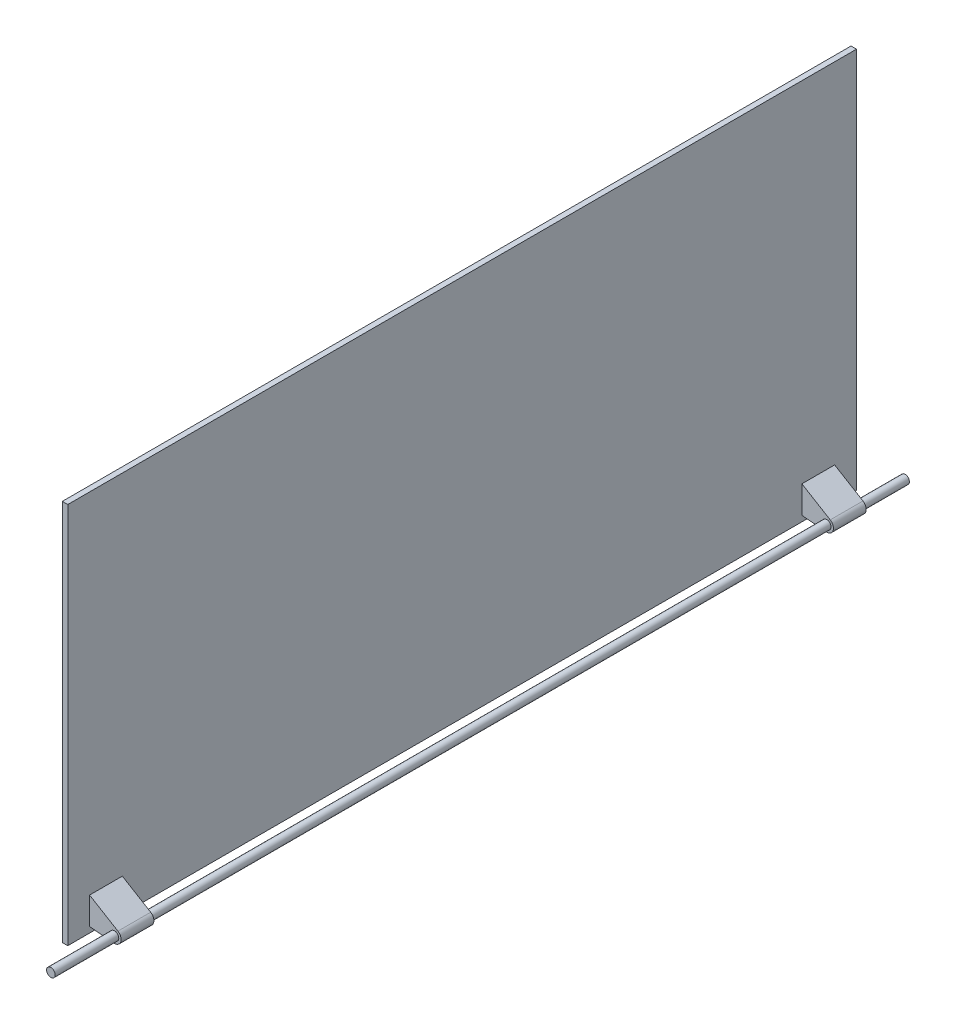
ISO-10303-21;
HEADER;
FILE_DESCRIPTION(('STEP AP214'),'2;1');
FILE_NAME('part.step','',(''),(''),'','','');
FILE_SCHEMA(('AUTOMOTIVE_DESIGN { 1 0 10303 214 1 1 1 1 }'));
ENDSEC;
DATA;
#1=APPLICATION_CONTEXT('core data for automotive mechanical design processes');
#2=APPLICATION_PROTOCOL_DEFINITION('international standard','automotive_design',2000,#1);
#3=PRODUCT_CONTEXT('',#1,'mechanical');
#4=PRODUCT('Part','Part','',(#3));
#5=PRODUCT_RELATED_PRODUCT_CATEGORY('part','',(#4));
#6=PRODUCT_DEFINITION_FORMATION('','',#4);
#7=PRODUCT_DEFINITION_CONTEXT('part definition',#1,'design');
#8=PRODUCT_DEFINITION('design','',#6,#7);
#9=PRODUCT_DEFINITION_SHAPE('','',#8);
#10=(LENGTH_UNIT() NAMED_UNIT(*) SI_UNIT(.MILLI.,.METRE.));
#11=(NAMED_UNIT(*) PLANE_ANGLE_UNIT() SI_UNIT($,.RADIAN.));
#12=(NAMED_UNIT(*) SI_UNIT($,.STERADIAN.) SOLID_ANGLE_UNIT());
#13=UNCERTAINTY_MEASURE_WITH_UNIT(LENGTH_MEASURE(1.E-05),#10,'distance_accuracy_value','');
#14=(GEOMETRIC_REPRESENTATION_CONTEXT(3) GLOBAL_UNCERTAINTY_ASSIGNED_CONTEXT((#13)) GLOBAL_UNIT_ASSIGNED_CONTEXT((#10,
#11,#12)) REPRESENTATION_CONTEXT('',''));
#15=CARTESIAN_POINT('',(0.,0.,0.));
#16=DIRECTION('',(0.,0.,1.));
#17=DIRECTION('',(1.,0.,0.));
#18=AXIS2_PLACEMENT_3D('',#15,#16,#17);
#19=CARTESIAN_POINT('',(28.2352802698537,-168.341733371633,-389.128));
#20=DIRECTION('',(0.,0.,1.));
#21=DIRECTION('',(1.,0.,0.));
#22=AXIS2_PLACEMENT_3D('',#19,#20,#21);
#23=CYLINDRICAL_SURFACE('',#22,4.00050000000002);
#24=CARTESIAN_POINT('',(28.2352802698537,-168.341733371633,316.23));
#25=DIRECTION('',(0.,0.,1.));
#26=DIRECTION('',(1.,0.,0.));
#27=AXIS2_PLACEMENT_3D('',#24,#25,#26);
#28=CIRCLE('',#27,4.00050000000002);
#29=CARTESIAN_POINT('',(32.2357802698537,-168.341733371633,316.23));
#30=VERTEX_POINT('',#29);
#31=EDGE_CURVE('E171',#30,#30,#28,.T.);
#32=CARTESIAN_POINT('',(28.2352802698537,-168.341733371633,-316.23));
#33=DIRECTION('',(0.,0.,1.));
#34=DIRECTION('',(1.,0.,0.));
#35=AXIS2_PLACEMENT_3D('',#32,#33,#34);
#36=CIRCLE('',#35,4.00050000000002);
#37=CARTESIAN_POINT('',(32.2357802698537,-168.341733371633,-316.23));
#38=VERTEX_POINT('',#37);
#39=EDGE_CURVE('E152',#38,#38,#36,.T.);
#40=CARTESIAN_POINT('',(32.2357802698537,-168.341733371633,316.23));
#41=CARTESIAN_POINT('',(32.2357802698537,-168.341733371633,309.641875));
#42=CARTESIAN_POINT('',(32.2357802698537,-168.341733371633,303.05375));
#43=CARTESIAN_POINT('',(32.2357802698537,-168.341733371633,289.8775));
#44=CARTESIAN_POINT('',(32.2357802698537,-168.341733371633,283.289375));
#45=CARTESIAN_POINT('',(32.2357802698537,-168.341733371633,270.113125));
#46=CARTESIAN_POINT('',(32.2357802698537,-168.341733371633,263.525));
#47=CARTESIAN_POINT('',(32.2357802698537,-168.341733371633,250.34875));
#48=CARTESIAN_POINT('',(32.2357802698537,-168.341733371633,243.760625));
#49=CARTESIAN_POINT('',(32.2357802698537,-168.341733371633,230.584375));
#50=CARTESIAN_POINT('',(32.2357802698537,-168.341733371633,223.99625));
#51=CARTESIAN_POINT('',(32.2357802698537,-168.341733371633,210.82));
#52=CARTESIAN_POINT('',(32.2357802698537,-168.341733371633,204.231875));
#53=CARTESIAN_POINT('',(32.2357802698537,-168.341733371633,191.055625));
#54=CARTESIAN_POINT('',(32.2357802698537,-168.341733371633,184.4675));
#55=CARTESIAN_POINT('',(32.2357802698537,-168.341733371633,171.29125));
#56=CARTESIAN_POINT('',(32.2357802698537,-168.341733371633,164.703125));
#57=CARTESIAN_POINT('',(32.2357802698537,-168.341733371633,151.526875));
#58=CARTESIAN_POINT('',(32.2357802698537,-168.341733371633,144.93875));
#59=CARTESIAN_POINT('',(32.2357802698537,-168.341733371633,131.7625));
#60=CARTESIAN_POINT('',(32.2357802698537,-168.341733371633,125.174375));
#61=CARTESIAN_POINT('',(32.2357802698537,-168.341733371633,111.998125));
#62=CARTESIAN_POINT('',(32.2357802698537,-168.341733371633,105.41));
#63=CARTESIAN_POINT('',(32.2357802698537,-168.341733371633,92.2337499999999));
#64=CARTESIAN_POINT('',(32.2357802698537,-168.341733371633,85.6456249999999));
#65=CARTESIAN_POINT('',(32.2357802698537,-168.341733371633,72.4693749999999));
#66=CARTESIAN_POINT('',(32.2357802698537,-168.341733371633,65.8812499999999));
#67=CARTESIAN_POINT('',(32.2357802698537,-168.341733371633,52.7049999999999));
#68=CARTESIAN_POINT('',(32.2357802698537,-168.341733371633,46.1168749999999));
#69=CARTESIAN_POINT('',(32.2357802698537,-168.341733371633,32.9406249999999));
#70=CARTESIAN_POINT('',(32.2357802698537,-168.341733371633,26.3524999999999));
#71=CARTESIAN_POINT('',(32.2357802698537,-168.341733371633,13.1762499999999));
#72=CARTESIAN_POINT('',(32.2357802698537,-168.341733371633,6.58812499999989));
#73=CARTESIAN_POINT('',(32.2357802698537,-168.341733371633,-6.58812500000011));
#74=CARTESIAN_POINT('',(32.2357802698537,-168.341733371633,-13.1762500000001));
#75=CARTESIAN_POINT('',(32.2357802698537,-168.341733371633,-26.3525000000001));
#76=CARTESIAN_POINT('',(32.2357802698537,-168.341733371633,-32.9406250000001));
#77=CARTESIAN_POINT('',(32.2357802698537,-168.341733371633,-46.1168750000001));
#78=CARTESIAN_POINT('',(32.2357802698537,-168.341733371633,-52.7050000000001));
#79=CARTESIAN_POINT('',(32.2357802698537,-168.341733371633,-65.8812500000001));
#80=CARTESIAN_POINT('',(32.2357802698537,-168.341733371633,-72.4693750000001));
#81=CARTESIAN_POINT('',(32.2357802698537,-168.341733371633,-85.6456250000001));
#82=CARTESIAN_POINT('',(32.2357802698537,-168.341733371633,-92.2337500000001));
#83=CARTESIAN_POINT('',(32.2357802698537,-168.341733371633,-105.41));
#84=CARTESIAN_POINT('',(32.2357802698537,-168.341733371633,-111.998125));
#85=CARTESIAN_POINT('',(32.2357802698537,-168.341733371633,-125.174375));
#86=CARTESIAN_POINT('',(32.2357802698537,-168.341733371633,-131.7625));
#87=CARTESIAN_POINT('',(32.2357802698537,-168.341733371633,-144.93875));
#88=CARTESIAN_POINT('',(32.2357802698537,-168.341733371633,-151.526875));
#89=CARTESIAN_POINT('',(32.2357802698537,-168.341733371633,-164.703125));
#90=CARTESIAN_POINT('',(32.2357802698537,-168.341733371633,-171.29125));
#91=CARTESIAN_POINT('',(32.2357802698537,-168.341733371633,-184.4675));
#92=CARTESIAN_POINT('',(32.2357802698537,-168.341733371633,-191.055625));
#93=CARTESIAN_POINT('',(32.2357802698537,-168.341733371633,-204.231875));
#94=CARTESIAN_POINT('',(32.2357802698537,-168.341733371633,-210.82));
#95=CARTESIAN_POINT('',(32.2357802698537,-168.341733371633,-223.99625));
#96=CARTESIAN_POINT('',(32.2357802698537,-168.341733371633,-230.584375));
#97=CARTESIAN_POINT('',(32.2357802698537,-168.341733371633,-243.760625));
#98=CARTESIAN_POINT('',(32.2357802698537,-168.341733371633,-250.34875));
#99=CARTESIAN_POINT('',(32.2357802698537,-168.341733371633,-263.525));
#100=CARTESIAN_POINT('',(32.2357802698537,-168.341733371633,-270.113125));
#101=CARTESIAN_POINT('',(32.2357802698537,-168.341733371633,-283.289375));
#102=CARTESIAN_POINT('',(32.2357802698537,-168.341733371633,-289.8775));
#103=CARTESIAN_POINT('',(32.2357802698537,-168.341733371633,-303.05375));
#104=CARTESIAN_POINT('',(32.2357802698537,-168.341733371633,-309.641875));
#105=CARTESIAN_POINT('',(32.2357802698537,-168.341733371633,-316.23));
#106=B_SPLINE_CURVE_WITH_KNOTS('',3,(#40,#41,#42,#43,#44,#45,#46,#47,#48,#49,#50,#51,#52,#53,
#54,#55,#56,#57,#58,#59,#60,#61,#62,#63,#64,#65,#66,#67,#68,#69,#70,#71,#72,#73,#74,#75,#76,#77,
#78,#79,#80,#81,#82,#83,#84,#85,#86,#87,#88,#89,#90,#91,#92,#93,#94,#95,#96,#97,#98,#99,#100,
#101,#102,#103,#104,#105),.UNSPECIFIED.,.F.,.F.,(4,2,2,2,2,2,2,2,2,2,2,2,2,2,2,2,2,2,2,2,2,2,2,
2,2,2,2,2,2,2,2,2,4),(0.,19.7643750000001,39.52875,59.2931249999999,79.0575,98.8218750000001,
118.58625,138.350625,158.115,177.879375,197.64375,217.408125,237.1725,256.936875,276.70125,
296.465625,316.23,335.994375,355.75875,375.523125,395.2875,415.051875,434.81625,454.580625,
474.345,494.109375,513.87375,533.638125,553.4025,573.166875,592.93125,612.695625,632.46),.UNSPECIFIED.);
#107=EDGE_CURVE('BSEAM44',#30,#38,#106,.T.);
#108=ORIENTED_EDGE('',*,*,#31,.F.);
#109=ORIENTED_EDGE('',*,*,#39,.T.);
#110=ORIENTED_EDGE('',*,*,#107,.T.);
#111=ORIENTED_EDGE('',*,*,#107,.F.);
#112=EDGE_LOOP('',(#108,#110,#109,#111));
#113=FACE_BOUND('',#112,.T.);
#114=ADVANCED_FACE('F44',(#113),#23,.T.);
#115=CARTESIAN_POINT('',(28.2352802698537,-168.341733371633,346.71));
#116=DIRECTION('',(0.,0.,1.));
#117=DIRECTION('',(1.,0.,0.));
#118=AXIS2_PLACEMENT_3D('',#115,#116,#117);
#119=PLANE('',#118);
#120=DIRECTION('',(-0.856344241861617,0.51640540220882,0.));
#121=VECTOR('',#120,1.);
#122=CARTESIAN_POINT('',(31.4392365882959,-163.028679842877,346.71));
#123=LINE('',#122,#121);
#124=CARTESIAN_POINT('',(31.4392365882959,-163.028679842877,346.71));
#125=VERTEX_POINT('',#124);
#126=CARTESIAN_POINT('',(5.08,-147.133142152678,346.71));
#127=VERTEX_POINT('',#126);
#128=EDGE_CURVE('E178',#125,#127,#123,.T.);
#129=ORIENTED_EDGE('',*,*,#128,.T.);
#130=DIRECTION('',(0.,-1.,0.));
#131=VECTOR('',#130,1.);
#132=CARTESIAN_POINT('',(5.08,-147.133142152678,346.71));
#133=LINE('',#132,#131);
#134=CARTESIAN_POINT('',(5.08,-172.533142152678,346.71));
#135=VERTEX_POINT('',#134);
#136=EDGE_CURVE('E93',#127,#135,#133,.T.);
#137=ORIENTED_EDGE('',*,*,#136,.T.);
#138=DIRECTION('',(0.996153242298804,-0.0876282937046096,0.));
#139=VECTOR('',#138,1.);
#140=CARTESIAN_POINT('',(5.08,-172.533142152678,346.71));
#141=LINE('',#140,#139);
#142=CARTESIAN_POINT('',(27.6916042662947,-174.522209914187,346.71));
#143=VERTEX_POINT('',#142);
#144=EDGE_CURVE('E181',#135,#143,#141,.T.);
#145=ORIENTED_EDGE('',*,*,#144,.T.);
#146=CARTESIAN_POINT('',(28.2352802698537,-168.341733371633,346.71));
#147=DIRECTION('',(0.,0.,1.));
#148=DIRECTION('',(1.,0.,0.));
#149=AXIS2_PLACEMENT_3D('',#146,#147,#148);
#150=CIRCLE('',#149,6.20434314733709);
#151=EDGE_CURVE('E61',#143,#125,#150,.T.);
#152=ORIENTED_EDGE('',*,*,#151,.T.);
#153=EDGE_LOOP('',(#129,#137,#145,#152));
#154=FACE_BOUND('',#153,.T.);
#155=CARTESIAN_POINT('',(28.2352802698537,-168.341733371633,346.71));
#156=DIRECTION('',(0.,0.,1.));
#157=DIRECTION('',(1.,0.,0.));
#158=AXIS2_PLACEMENT_3D('',#155,#156,#157);
#159=CIRCLE('',#158,4.00050000000002);
#160=CARTESIAN_POINT('',(32.2357802698537,-168.341733371633,346.71));
#161=VERTEX_POINT('',#160);
#162=EDGE_CURVE('E174',#161,#161,#159,.T.);
#163=ORIENTED_EDGE('',*,*,#162,.F.);
#164=EDGE_LOOP('',(#163));
#165=FACE_BOUND('',#164,.T.);
#166=ADVANCED_FACE('F204',(#154,#165),#119,.T.);
#167=CARTESIAN_POINT('',(28.2352802698537,-168.341733371633,316.23));
#168=DIRECTION('',(0.,0.,1.));
#169=DIRECTION('',(1.,0.,0.));
#170=AXIS2_PLACEMENT_3D('',#167,#168,#169);
#171=PLANE('',#170);
#172=DIRECTION('',(-0.856344241861617,0.51640540220882,0.));
#173=VECTOR('',#172,1.);
#174=CARTESIAN_POINT('',(31.4392365882959,-163.028679842877,316.23));
#175=LINE('',#174,#173);
#176=CARTESIAN_POINT('',(31.4392365882959,-163.028679842877,316.23));
#177=VERTEX_POINT('',#176);
#178=CARTESIAN_POINT('',(5.08,-147.133142152678,316.23));
#179=VERTEX_POINT('',#178);
#180=EDGE_CURVE('E177',#177,#179,#175,.T.);
#181=ORIENTED_EDGE('',*,*,#180,.F.);
#182=CARTESIAN_POINT('',(28.2352802698537,-168.341733371633,316.23));
#183=DIRECTION('',(0.,0.,1.));
#184=DIRECTION('',(1.,0.,0.));
#185=AXIS2_PLACEMENT_3D('',#182,#183,#184);
#186=CIRCLE('',#185,6.20434314733709);
#187=CARTESIAN_POINT('',(27.6916042662947,-174.522209914187,316.23));
#188=VERTEX_POINT('',#187);
#189=EDGE_CURVE('E85',#188,#177,#186,.T.);
#190=ORIENTED_EDGE('',*,*,#189,.F.);
#191=DIRECTION('',(0.996153242298804,-0.0876282937046096,0.));
#192=VECTOR('',#191,1.);
#193=CARTESIAN_POINT('',(5.08,-172.533142152678,316.23));
#194=LINE('',#193,#192);
#195=CARTESIAN_POINT('',(5.08,-172.533142152678,316.23));
#196=VERTEX_POINT('',#195);
#197=EDGE_CURVE('E79',#196,#188,#194,.T.);
#198=ORIENTED_EDGE('',*,*,#197,.F.);
#199=DIRECTION('',(0.,-1.,0.));
#200=VECTOR('',#199,1.);
#201=CARTESIAN_POINT('',(5.08,-147.133142152678,316.23));
#202=LINE('',#201,#200);
#203=EDGE_CURVE('E187',#179,#196,#202,.T.);
#204=ORIENTED_EDGE('',*,*,#203,.F.);
#205=EDGE_LOOP('',(#181,#190,#198,#204));
#206=FACE_BOUND('',#205,.T.);
#207=ORIENTED_EDGE('',*,*,#31,.T.);
#208=EDGE_LOOP('',(#207));
#209=FACE_BOUND('',#208,.T.);
#210=ADVANCED_FACE('F201',(#206,#209),#171,.F.);
#211=CARTESIAN_POINT('',(31.4392365882959,-163.028679842877,346.71));
#212=DIRECTION('',(-0.51640540220882,-0.856344241861617,0.));
#213=DIRECTION('',(0.856344241861617,-0.51640540220882,0.));
#214=AXIS2_PLACEMENT_3D('',#211,#212,#213);
#215=PLANE('',#214);
#216=ORIENTED_EDGE('',*,*,#180,.T.);
#217=DIRECTION('',(0.,0.,-1.));
#218=VECTOR('',#217,1.);
#219=CARTESIAN_POINT('',(5.08,-147.133142152678,346.71));
#220=LINE('',#219,#218);
#221=EDGE_CURVE('E53',#127,#179,#220,.T.);
#222=ORIENTED_EDGE('',*,*,#221,.F.);
#223=ORIENTED_EDGE('',*,*,#128,.F.);
#224=DIRECTION('',(0.,0.,-1.));
#225=VECTOR('',#224,1.);
#226=CARTESIAN_POINT('',(31.4392365882959,-163.028679842877,346.71));
#227=LINE('',#226,#225);
#228=EDGE_CURVE('E184',#125,#177,#227,.T.);
#229=ORIENTED_EDGE('',*,*,#228,.T.);
#230=EDGE_LOOP('',(#216,#222,#223,#229));
#231=FACE_BOUND('',#230,.T.);
#232=ADVANCED_FACE('F46',(#231),#215,.F.);
#233=CARTESIAN_POINT('',(5.08,-147.133142152678,346.71));
#234=DIRECTION('',(1.,0.,0.));
#235=DIRECTION('',(0.,1.,0.));
#236=AXIS2_PLACEMENT_3D('',#233,#234,#235);
#237=PLANE('',#236);
#238=ORIENTED_EDGE('',*,*,#203,.T.);
#239=DIRECTION('',(0.,0.,-1.));
#240=VECTOR('',#239,1.);
#241=CARTESIAN_POINT('',(5.08,-172.533142152678,346.71));
#242=LINE('',#241,#240);
#243=EDGE_CURVE('E194',#135,#196,#242,.T.);
#244=ORIENTED_EDGE('',*,*,#243,.F.);
#245=ORIENTED_EDGE('',*,*,#136,.F.);
#246=ORIENTED_EDGE('',*,*,#221,.T.);
#247=EDGE_LOOP('',(#238,#244,#245,#246));
#248=FACE_BOUND('',#247,.T.);
#249=ADVANCED_FACE('F196',(#248),#237,.F.);
#250=CARTESIAN_POINT('',(5.08,-172.533142152678,346.71));
#251=DIRECTION('',(0.0876282937046096,0.996153242298803,0.));
#252=DIRECTION('',(-0.996153242298804,0.0876282937046096,0.));
#253=AXIS2_PLACEMENT_3D('',#250,#251,#252);
#254=PLANE('',#253);
#255=ORIENTED_EDGE('',*,*,#197,.T.);
#256=DIRECTION('',(0.,0.,-1.));
#257=VECTOR('',#256,1.);
#258=CARTESIAN_POINT('',(27.6916042662947,-174.522209914187,346.71));
#259=LINE('',#258,#257);
#260=EDGE_CURVE('E192',#143,#188,#259,.T.);
#261=ORIENTED_EDGE('',*,*,#260,.F.);
#262=ORIENTED_EDGE('',*,*,#144,.F.);
#263=ORIENTED_EDGE('',*,*,#243,.T.);
#264=EDGE_LOOP('',(#255,#261,#262,#263));
#265=FACE_BOUND('',#264,.T.);
#266=ADVANCED_FACE('F252',(#265),#254,.F.);
#267=CARTESIAN_POINT('',(28.2352802698537,-168.341733371633,346.71));
#268=DIRECTION('',(0.,0.,-1.));
#269=DIRECTION('',(-1.,0.,0.));
#270=AXIS2_PLACEMENT_3D('',#267,#268,#269);
#271=CYLINDRICAL_SURFACE('',#270,6.20434314733709);
#272=ORIENTED_EDGE('',*,*,#189,.T.);
#273=ORIENTED_EDGE('',*,*,#228,.F.);
#274=ORIENTED_EDGE('',*,*,#151,.F.);
#275=ORIENTED_EDGE('',*,*,#260,.T.);
#276=EDGE_LOOP('',(#272,#273,#274,#275));
#277=FACE_BOUND('',#276,.T.);
#278=ADVANCED_FACE('F246',(#277),#271,.T.);
#279=CARTESIAN_POINT('',(28.2352802698537,-168.341733371633,405.892));
#280=DIRECTION('',(0.,0.,1.));
#281=DIRECTION('',(1.,0.,0.));
#282=AXIS2_PLACEMENT_3D('',#279,#280,#281);
#283=CIRCLE('',#282,4.00050000000002);
#284=CARTESIAN_POINT('',(32.2357802698537,-168.341733371633,405.892));
#285=VERTEX_POINT('',#284);
#286=EDGE_CURVE('E131',#285,#285,#283,.T.);
#287=CARTESIAN_POINT('',(32.2357802698537,-168.341733371633,346.71));
#288=CARTESIAN_POINT('',(32.2357802698537,-168.341733371633,347.326479166667));
#289=CARTESIAN_POINT('',(32.2357802698537,-168.341733371633,347.942958333333));
#290=CARTESIAN_POINT('',(32.2357802698537,-168.341733371633,349.175916666667));
#291=CARTESIAN_POINT('',(32.2357802698537,-168.341733371633,349.792395833333));
#292=CARTESIAN_POINT('',(32.2357802698537,-168.341733371633,351.025354166667));
#293=CARTESIAN_POINT('',(32.2357802698537,-168.341733371633,351.641833333333));
#294=CARTESIAN_POINT('',(32.2357802698537,-168.341733371633,352.874791666667));
#295=CARTESIAN_POINT('',(32.2357802698537,-168.341733371633,353.491270833333));
#296=CARTESIAN_POINT('',(32.2357802698537,-168.341733371633,354.724229166667));
#297=CARTESIAN_POINT('',(32.2357802698537,-168.341733371633,355.340708333333));
#298=CARTESIAN_POINT('',(32.2357802698537,-168.341733371633,356.573666666667));
#299=CARTESIAN_POINT('',(32.2357802698537,-168.341733371633,357.190145833333));
#300=CARTESIAN_POINT('',(32.2357802698537,-168.341733371633,358.423104166667));
#301=CARTESIAN_POINT('',(32.2357802698537,-168.341733371633,359.039583333333));
#302=CARTESIAN_POINT('',(32.2357802698537,-168.341733371633,360.272541666667));
#303=CARTESIAN_POINT('',(32.2357802698537,-168.341733371633,360.889020833333));
#304=CARTESIAN_POINT('',(32.2357802698537,-168.341733371633,362.121979166667));
#305=CARTESIAN_POINT('',(32.2357802698537,-168.341733371633,362.738458333333));
#306=CARTESIAN_POINT('',(32.2357802698537,-168.341733371633,363.971416666667));
#307=CARTESIAN_POINT('',(32.2357802698537,-168.341733371633,364.587895833333));
#308=CARTESIAN_POINT('',(32.2357802698537,-168.341733371633,365.820854166667));
#309=CARTESIAN_POINT('',(32.2357802698537,-168.341733371633,366.437333333333));
#310=CARTESIAN_POINT('',(32.2357802698537,-168.341733371633,367.670291666667));
#311=CARTESIAN_POINT('',(32.2357802698537,-168.341733371633,368.286770833333));
#312=CARTESIAN_POINT('',(32.2357802698537,-168.341733371633,369.519729166667));
#313=CARTESIAN_POINT('',(32.2357802698537,-168.341733371633,370.136208333333));
#314=CARTESIAN_POINT('',(32.2357802698537,-168.341733371633,371.369166666667));
#315=CARTESIAN_POINT('',(32.2357802698537,-168.341733371633,371.985645833333));
#316=CARTESIAN_POINT('',(32.2357802698537,-168.341733371633,373.218604166667));
#317=CARTESIAN_POINT('',(32.2357802698537,-168.341733371633,373.835083333333));
#318=CARTESIAN_POINT('',(32.2357802698537,-168.341733371633,375.068041666667));
#319=CARTESIAN_POINT('',(32.2357802698537,-168.341733371633,375.684520833333));
#320=CARTESIAN_POINT('',(32.2357802698537,-168.341733371633,376.917479166667));
#321=CARTESIAN_POINT('',(32.2357802698537,-168.341733371633,377.533958333333));
#322=CARTESIAN_POINT('',(32.2357802698537,-168.341733371633,378.766916666667));
#323=CARTESIAN_POINT('',(32.2357802698537,-168.341733371633,379.383395833333));
#324=CARTESIAN_POINT('',(32.2357802698537,-168.341733371633,380.616354166667));
#325=CARTESIAN_POINT('',(32.2357802698537,-168.341733371633,381.232833333333));
#326=CARTESIAN_POINT('',(32.2357802698537,-168.341733371633,382.465791666667));
#327=CARTESIAN_POINT('',(32.2357802698537,-168.341733371633,383.082270833333));
#328=CARTESIAN_POINT('',(32.2357802698537,-168.341733371633,384.315229166667));
#329=CARTESIAN_POINT('',(32.2357802698537,-168.341733371633,384.931708333333));
#330=CARTESIAN_POINT('',(32.2357802698537,-168.341733371633,386.164666666667));
#331=CARTESIAN_POINT('',(32.2357802698537,-168.341733371633,386.781145833333));
#332=CARTESIAN_POINT('',(32.2357802698537,-168.341733371633,388.014104166667));
#333=CARTESIAN_POINT('',(32.2357802698537,-168.341733371633,388.630583333333));
#334=CARTESIAN_POINT('',(32.2357802698537,-168.341733371633,389.863541666667));
#335=CARTESIAN_POINT('',(32.2357802698537,-168.341733371633,390.480020833333));
#336=CARTESIAN_POINT('',(32.2357802698537,-168.341733371633,391.712979166667));
#337=CARTESIAN_POINT('',(32.2357802698537,-168.341733371633,392.329458333333));
#338=CARTESIAN_POINT('',(32.2357802698537,-168.341733371633,393.562416666667));
#339=CARTESIAN_POINT('',(32.2357802698537,-168.341733371633,394.178895833333));
#340=CARTESIAN_POINT('',(32.2357802698537,-168.341733371633,395.411854166667));
#341=CARTESIAN_POINT('',(32.2357802698537,-168.341733371633,396.028333333333));
#342=CARTESIAN_POINT('',(32.2357802698537,-168.341733371633,397.261291666667));
#343=CARTESIAN_POINT('',(32.2357802698537,-168.341733371633,397.877770833333));
#344=CARTESIAN_POINT('',(32.2357802698537,-168.341733371633,399.110729166667));
#345=CARTESIAN_POINT('',(32.2357802698537,-168.341733371633,399.727208333333));
#346=CARTESIAN_POINT('',(32.2357802698537,-168.341733371633,400.960166666667));
#347=CARTESIAN_POINT('',(32.2357802698537,-168.341733371633,401.576645833333));
#348=CARTESIAN_POINT('',(32.2357802698537,-168.341733371633,402.809604166667));
#349=CARTESIAN_POINT('',(32.2357802698537,-168.341733371633,403.426083333333));
#350=CARTESIAN_POINT('',(32.2357802698537,-168.341733371633,404.659041666667));
#351=CARTESIAN_POINT('',(32.2357802698537,-168.341733371633,405.275520833333));
#352=CARTESIAN_POINT('',(32.2357802698537,-168.341733371633,405.892));
#353=B_SPLINE_CURVE_WITH_KNOTS('',3,(#287,#288,#289,#290,#291,#292,#293,#294,#295,#296,#297,
#298,#299,#300,#301,#302,#303,#304,#305,#306,#307,#308,#309,#310,#311,#312,#313,#314,#315,#316,
#317,#318,#319,#320,#321,#322,#323,#324,#325,#326,#327,#328,#329,#330,#331,#332,#333,#334,#335,
#336,#337,#338,#339,#340,#341,#342,#343,#344,#345,#346,#347,#348,#349,#350,#351,#352),
.UNSPECIFIED.,.F.,.F.,(4,2,2,2,2,2,2,2,2,2,2,2,2,2,2,2,2,2,2,2,2,2,2,2,2,2,2,2,2,2,2,2,4),(0.,
1.8494375,3.69887499999999,5.54831249999999,7.39774999999998,9.24718749999998,11.096625,
12.9460625,14.7955,16.6449375000001,18.4943750000001,20.3438125000001,22.1932500000001,
24.0426875,25.892125,27.7415625,29.591,31.4404375,33.289875,35.1393125,36.98875,38.8381875,
40.687625,42.5370625,44.3865000000001,46.2359375000001,48.0853750000001,49.9348125000001,
51.7842500000001,53.6336875000001,55.4831250000001,57.3325625000001,59.1820000000001),.UNSPECIFIED.);
#354=EDGE_CURVE('BSEAM212',#161,#285,#353,.T.);
#355=ORIENTED_EDGE('',*,*,#162,.T.);
#356=ORIENTED_EDGE('',*,*,#286,.F.);
#357=ORIENTED_EDGE('',*,*,#354,.T.);
#358=ORIENTED_EDGE('',*,*,#354,.F.);
#359=EDGE_LOOP('',(#355,#357,#356,#358));
#360=FACE_BOUND('',#359,.T.);
#361=ADVANCED_FACE('F212',(#360),#23,.T.);
#362=CARTESIAN_POINT('',(28.2352802698537,-168.341733371633,405.892));
#363=DIRECTION('',(0.,0.,1.));
#364=DIRECTION('',(1.,0.,0.));
#365=AXIS2_PLACEMENT_3D('',#362,#363,#364);
#366=PLANE('',#365);
#367=ORIENTED_EDGE('',*,*,#286,.T.);
#368=EDGE_LOOP('',(#367));
#369=FACE_BOUND('',#368,.T.);
#370=ADVANCED_FACE('F225',(#369),#366,.T.);
#371=CARTESIAN_POINT('',(28.2352802698537,-168.341733371633,-346.71));
#372=DIRECTION('',(0.,0.,-1.));
#373=DIRECTION('',(1.,0.,0.));
#374=AXIS2_PLACEMENT_3D('',#371,#372,#373);
#375=PLANE('',#374);
#376=DIRECTION('',(-0.856344241861617,0.51640540220882,0.));
#377=VECTOR('',#376,1.);
#378=CARTESIAN_POINT('',(31.4392365882959,-163.028679842877,-346.71));
#379=LINE('',#378,#377);
#380=CARTESIAN_POINT('',(31.4392365882959,-163.028679842877,-346.71));
#381=VERTEX_POINT('',#380);
#382=CARTESIAN_POINT('',(5.08,-147.133142152678,-346.71));
#383=VERTEX_POINT('',#382);
#384=EDGE_CURVE('E139',#381,#383,#379,.T.);
#385=ORIENTED_EDGE('',*,*,#384,.F.);
#386=CARTESIAN_POINT('',(28.2352802698537,-168.341733371633,-346.71));
#387=DIRECTION('',(0.,0.,1.));
#388=DIRECTION('',(1.,0.,0.));
#389=AXIS2_PLACEMENT_3D('',#386,#387,#388);
#390=CIRCLE('',#389,6.20434314733709);
#391=CARTESIAN_POINT('',(27.6916042662947,-174.522209914187,-346.71));
#392=VERTEX_POINT('',#391);
#393=EDGE_CURVE('E155',#392,#381,#390,.T.);
#394=ORIENTED_EDGE('',*,*,#393,.F.);
#395=DIRECTION('',(0.996153242298804,-0.0876282937046096,0.));
#396=VECTOR('',#395,1.);
#397=CARTESIAN_POINT('',(5.08,-172.533142152678,-346.71));
#398=LINE('',#397,#396);
#399=CARTESIAN_POINT('',(5.08,-172.533142152678,-346.71));
#400=VERTEX_POINT('',#399);
#401=EDGE_CURVE('E141',#400,#392,#398,.T.);
#402=ORIENTED_EDGE('',*,*,#401,.F.);
#403=DIRECTION('',(0.,-1.,0.));
#404=VECTOR('',#403,1.);
#405=CARTESIAN_POINT('',(5.08,-147.133142152678,-346.71));
#406=LINE('',#405,#404);
#407=EDGE_CURVE('E123',#383,#400,#406,.T.);
#408=ORIENTED_EDGE('',*,*,#407,.F.);
#409=EDGE_LOOP('',(#385,#394,#402,#408));
#410=FACE_BOUND('',#409,.T.);
#411=CARTESIAN_POINT('',(28.2352802698537,-168.341733371633,-346.71));
#412=DIRECTION('',(0.,0.,-1.));
#413=DIRECTION('',(-1.,0.,0.));
#414=AXIS2_PLACEMENT_3D('',#411,#412,#413);
#415=CIRCLE('',#414,4.00050000000002);
#416=CARTESIAN_POINT('',(32.2357802698537,-168.341733371633,-346.71));
#417=VERTEX_POINT('',#416);
#418=EDGE_CURVE('E12',#417,#417,#415,.F.);
#419=ORIENTED_EDGE('',*,*,#418,.T.);
#420=EDGE_LOOP('',(#419));
#421=FACE_BOUND('',#420,.T.);
#422=ADVANCED_FACE('F136',(#410,#421),#375,.T.);
#423=CARTESIAN_POINT('',(28.2352802698537,-168.341733371633,-316.23));
#424=DIRECTION('',(0.,0.,-1.));
#425=DIRECTION('',(1.,0.,0.));
#426=AXIS2_PLACEMENT_3D('',#423,#424,#425);
#427=PLANE('',#426);
#428=DIRECTION('',(-0.856344241861617,0.51640540220882,0.));
#429=VECTOR('',#428,1.);
#430=CARTESIAN_POINT('',(31.4392365882959,-163.028679842877,-316.23));
#431=LINE('',#430,#429);
#432=CARTESIAN_POINT('',(31.4392365882959,-163.028679842877,-316.23));
#433=VERTEX_POINT('',#432);
#434=CARTESIAN_POINT('',(5.08,-147.133142152678,-316.23));
#435=VERTEX_POINT('',#434);
#436=EDGE_CURVE('E157',#433,#435,#431,.T.);
#437=ORIENTED_EDGE('',*,*,#436,.T.);
#438=DIRECTION('',(0.,-1.,0.));
#439=VECTOR('',#438,1.);
#440=CARTESIAN_POINT('',(5.08,-147.133142152678,-316.23));
#441=LINE('',#440,#439);
#442=CARTESIAN_POINT('',(5.08,-172.533142152678,-316.23));
#443=VERTEX_POINT('',#442);
#444=EDGE_CURVE('E126',#435,#443,#441,.T.);
#445=ORIENTED_EDGE('',*,*,#444,.T.);
#446=DIRECTION('',(0.996153242298804,-0.0876282937046096,0.));
#447=VECTOR('',#446,1.);
#448=CARTESIAN_POINT('',(5.08,-172.533142152678,-316.23));
#449=LINE('',#448,#447);
#450=CARTESIAN_POINT('',(27.6916042662947,-174.522209914187,-316.23));
#451=VERTEX_POINT('',#450);
#452=EDGE_CURVE('E149',#443,#451,#449,.T.);
#453=ORIENTED_EDGE('',*,*,#452,.T.);
#454=CARTESIAN_POINT('',(28.2352802698537,-168.341733371633,-316.23));
#455=DIRECTION('',(0.,0.,1.));
#456=DIRECTION('',(1.,0.,0.));
#457=AXIS2_PLACEMENT_3D('',#454,#455,#456);
#458=CIRCLE('',#457,6.20434314733709);
#459=EDGE_CURVE('E146',#451,#433,#458,.T.);
#460=ORIENTED_EDGE('',*,*,#459,.T.);
#461=EDGE_LOOP('',(#437,#445,#453,#460));
#462=FACE_BOUND('',#461,.T.);
#463=ORIENTED_EDGE('',*,*,#39,.F.);
#464=EDGE_LOOP('',(#463));
#465=FACE_BOUND('',#464,.T.);
#466=ADVANCED_FACE('F216',(#462,#465),#427,.F.);
#467=CARTESIAN_POINT('',(31.4392365882959,-163.028679842877,-346.71));
#468=DIRECTION('',(-0.51640540220882,-0.856344241861617,0.));
#469=DIRECTION('',(0.856344241861617,-0.51640540220882,0.));
#470=AXIS2_PLACEMENT_3D('',#467,#468,#469);
#471=PLANE('',#470);
#472=ORIENTED_EDGE('',*,*,#436,.F.);
#473=DIRECTION('',(0.,0.,1.));
#474=VECTOR('',#473,1.);
#475=CARTESIAN_POINT('',(31.4392365882959,-163.028679842877,-346.71));
#476=LINE('',#475,#474);
#477=EDGE_CURVE('E144',#381,#433,#476,.T.);
#478=ORIENTED_EDGE('',*,*,#477,.F.);
#479=ORIENTED_EDGE('',*,*,#384,.T.);
#480=DIRECTION('',(0.,0.,1.));
#481=VECTOR('',#480,1.);
#482=CARTESIAN_POINT('',(5.08,-147.133142152678,-346.71));
#483=LINE('',#482,#481);
#484=EDGE_CURVE('E120',#383,#435,#483,.T.);
#485=ORIENTED_EDGE('',*,*,#484,.T.);
#486=EDGE_LOOP('',(#472,#478,#479,#485));
#487=FACE_BOUND('',#486,.T.);
#488=ADVANCED_FACE('F143',(#487),#471,.F.);
#489=CARTESIAN_POINT('',(5.08,-147.133142152678,-346.71));
#490=DIRECTION('',(1.,0.,0.));
#491=DIRECTION('',(0.,1.,0.));
#492=AXIS2_PLACEMENT_3D('',#489,#490,#491);
#493=PLANE('',#492);
#494=ORIENTED_EDGE('',*,*,#444,.F.);
#495=ORIENTED_EDGE('',*,*,#484,.F.);
#496=ORIENTED_EDGE('',*,*,#407,.T.);
#497=DIRECTION('',(0.,0.,1.));
#498=VECTOR('',#497,1.);
#499=CARTESIAN_POINT('',(5.08,-172.533142152678,-346.71));
#500=LINE('',#499,#498);
#501=EDGE_CURVE('E132',#400,#443,#500,.T.);
#502=ORIENTED_EDGE('',*,*,#501,.T.);
#503=EDGE_LOOP('',(#494,#495,#496,#502));
#504=FACE_BOUND('',#503,.T.);
#505=ADVANCED_FACE('F122',(#504),#493,.F.);
#506=CARTESIAN_POINT('',(5.08,-172.533142152678,-346.71));
#507=DIRECTION('',(0.0876282937046096,0.996153242298803,0.));
#508=DIRECTION('',(-0.996153242298804,0.0876282937046096,0.));
#509=AXIS2_PLACEMENT_3D('',#506,#507,#508);
#510=PLANE('',#509);
#511=ORIENTED_EDGE('',*,*,#452,.F.);
#512=ORIENTED_EDGE('',*,*,#501,.F.);
#513=ORIENTED_EDGE('',*,*,#401,.T.);
#514=DIRECTION('',(0.,0.,1.));
#515=VECTOR('',#514,1.);
#516=CARTESIAN_POINT('',(27.6916042662947,-174.522209914187,-346.71));
#517=LINE('',#516,#515);
#518=EDGE_CURVE('E163',#392,#451,#517,.T.);
#519=ORIENTED_EDGE('',*,*,#518,.T.);
#520=EDGE_LOOP('',(#511,#512,#513,#519));
#521=FACE_BOUND('',#520,.T.);
#522=ADVANCED_FACE('F232',(#521),#510,.F.);
#523=CARTESIAN_POINT('',(28.2352802698537,-168.341733371633,-346.71));
#524=DIRECTION('',(0.,0.,1.));
#525=DIRECTION('',(-1.,0.,0.));
#526=AXIS2_PLACEMENT_3D('',#523,#524,#525);
#527=CYLINDRICAL_SURFACE('',#526,6.20434314733709);
#528=ORIENTED_EDGE('',*,*,#459,.F.);
#529=ORIENTED_EDGE('',*,*,#518,.F.);
#530=ORIENTED_EDGE('',*,*,#393,.T.);
#531=ORIENTED_EDGE('',*,*,#477,.T.);
#532=EDGE_LOOP('',(#528,#529,#530,#531));
#533=FACE_BOUND('',#532,.T.);
#534=ADVANCED_FACE('F228',(#533),#527,.T.);
#535=CARTESIAN_POINT('',(28.2352802698537,-168.341733371633,-389.128));
#536=DIRECTION('',(0.,0.,1.));
#537=DIRECTION('',(1.,0.,0.));
#538=AXIS2_PLACEMENT_3D('',#535,#536,#537);
#539=PLANE('',#538);
#540=CARTESIAN_POINT('',(28.2352802698537,-168.341733371633,-389.128));
#541=DIRECTION('',(0.,0.,1.));
#542=DIRECTION('',(1.,0.,0.));
#543=AXIS2_PLACEMENT_3D('',#540,#541,#542);
#544=CIRCLE('',#543,4.00050000000002);
#545=CARTESIAN_POINT('',(32.2357802698537,-168.341733371633,-389.128));
#546=VERTEX_POINT('',#545);
#547=EDGE_CURVE('E168',#546,#546,#544,.T.);
#548=ORIENTED_EDGE('',*,*,#547,.F.);
#549=EDGE_LOOP('',(#548));
#550=FACE_BOUND('',#549,.T.);
#551=ADVANCED_FACE('F231',(#550),#539,.F.);
#552=CARTESIAN_POINT('',(32.2357802698537,-168.341733371633,-346.71));
#553=CARTESIAN_POINT('',(32.2357802698537,-168.341733371633,-347.151854166667));
#554=CARTESIAN_POINT('',(32.2357802698537,-168.341733371633,-347.593708333333));
#555=CARTESIAN_POINT('',(32.2357802698537,-168.341733371633,-348.477416666667));
#556=CARTESIAN_POINT('',(32.2357802698537,-168.341733371633,-348.919270833333));
#557=CARTESIAN_POINT('',(32.2357802698537,-168.341733371633,-349.802979166667));
#558=CARTESIAN_POINT('',(32.2357802698537,-168.341733371633,-350.244833333333));
#559=CARTESIAN_POINT('',(32.2357802698537,-168.341733371633,-351.128541666667));
#560=CARTESIAN_POINT('',(32.2357802698537,-168.341733371633,-351.570395833333));
#561=CARTESIAN_POINT('',(32.2357802698537,-168.341733371633,-352.454104166667));
#562=CARTESIAN_POINT('',(32.2357802698537,-168.341733371633,-352.895958333333));
#563=CARTESIAN_POINT('',(32.2357802698537,-168.341733371633,-353.779666666667));
#564=CARTESIAN_POINT('',(32.2357802698537,-168.341733371633,-354.221520833333));
#565=CARTESIAN_POINT('',(32.2357802698537,-168.341733371633,-355.105229166667));
#566=CARTESIAN_POINT('',(32.2357802698537,-168.341733371633,-355.547083333333));
#567=CARTESIAN_POINT('',(32.2357802698537,-168.341733371633,-356.430791666667));
#568=CARTESIAN_POINT('',(32.2357802698537,-168.341733371633,-356.872645833333));
#569=CARTESIAN_POINT('',(32.2357802698537,-168.341733371633,-357.756354166667));
#570=CARTESIAN_POINT('',(32.2357802698537,-168.341733371633,-358.198208333333));
#571=CARTESIAN_POINT('',(32.2357802698537,-168.341733371633,-359.081916666667));
#572=CARTESIAN_POINT('',(32.2357802698537,-168.341733371633,-359.523770833333));
#573=CARTESIAN_POINT('',(32.2357802698537,-168.341733371633,-360.407479166667));
#574=CARTESIAN_POINT('',(32.2357802698537,-168.341733371633,-360.849333333333));
#575=CARTESIAN_POINT('',(32.2357802698537,-168.341733371633,-361.733041666667));
#576=CARTESIAN_POINT('',(32.2357802698537,-168.341733371633,-362.174895833333));
#577=CARTESIAN_POINT('',(32.2357802698537,-168.341733371633,-363.058604166667));
#578=CARTESIAN_POINT('',(32.2357802698537,-168.341733371633,-363.500458333333));
#579=CARTESIAN_POINT('',(32.2357802698537,-168.341733371633,-364.384166666667));
#580=CARTESIAN_POINT('',(32.2357802698537,-168.341733371633,-364.826020833333));
#581=CARTESIAN_POINT('',(32.2357802698537,-168.341733371633,-365.709729166667));
#582=CARTESIAN_POINT('',(32.2357802698537,-168.341733371633,-366.151583333333));
#583=CARTESIAN_POINT('',(32.2357802698537,-168.341733371633,-367.035291666667));
#584=CARTESIAN_POINT('',(32.2357802698537,-168.341733371633,-367.477145833333));
#585=CARTESIAN_POINT('',(32.2357802698537,-168.341733371633,-368.360854166667));
#586=CARTESIAN_POINT('',(32.2357802698537,-168.341733371633,-368.802708333333));
#587=CARTESIAN_POINT('',(32.2357802698537,-168.341733371633,-369.686416666667));
#588=CARTESIAN_POINT('',(32.2357802698537,-168.341733371633,-370.128270833333));
#589=CARTESIAN_POINT('',(32.2357802698537,-168.341733371633,-371.011979166667));
#590=CARTESIAN_POINT('',(32.2357802698537,-168.341733371633,-371.453833333333));
#591=CARTESIAN_POINT('',(32.2357802698537,-168.341733371633,-372.337541666667));
#592=CARTESIAN_POINT('',(32.2357802698537,-168.341733371633,-372.779395833333));
#593=CARTESIAN_POINT('',(32.2357802698537,-168.341733371633,-373.663104166667));
#594=CARTESIAN_POINT('',(32.2357802698537,-168.341733371633,-374.104958333333));
#595=CARTESIAN_POINT('',(32.2357802698537,-168.341733371633,-374.988666666667));
#596=CARTESIAN_POINT('',(32.2357802698537,-168.341733371633,-375.430520833333));
#597=CARTESIAN_POINT('',(32.2357802698537,-168.341733371633,-376.314229166667));
#598=CARTESIAN_POINT('',(32.2357802698537,-168.341733371633,-376.756083333333));
#599=CARTESIAN_POINT('',(32.2357802698537,-168.341733371633,-377.639791666667));
#600=CARTESIAN_POINT('',(32.2357802698537,-168.341733371633,-378.081645833333));
#601=CARTESIAN_POINT('',(32.2357802698537,-168.341733371633,-378.965354166667));
#602=CARTESIAN_POINT('',(32.2357802698537,-168.341733371633,-379.407208333333));
#603=CARTESIAN_POINT('',(32.2357802698537,-168.341733371633,-380.290916666667));
#604=CARTESIAN_POINT('',(32.2357802698537,-168.341733371633,-380.732770833333));
#605=CARTESIAN_POINT('',(32.2357802698537,-168.341733371633,-381.616479166667));
#606=CARTESIAN_POINT('',(32.2357802698537,-168.341733371633,-382.058333333333));
#607=CARTESIAN_POINT('',(32.2357802698537,-168.341733371633,-382.942041666667));
#608=CARTESIAN_POINT('',(32.2357802698537,-168.341733371633,-383.383895833333));
#609=CARTESIAN_POINT('',(32.2357802698537,-168.341733371633,-384.267604166667));
#610=CARTESIAN_POINT('',(32.2357802698537,-168.341733371633,-384.709458333333));
#611=CARTESIAN_POINT('',(32.2357802698537,-168.341733371633,-385.593166666667));
#612=CARTESIAN_POINT('',(32.2357802698537,-168.341733371633,-386.035020833333));
#613=CARTESIAN_POINT('',(32.2357802698537,-168.341733371633,-386.918729166667));
#614=CARTESIAN_POINT('',(32.2357802698537,-168.341733371633,-387.360583333333));
#615=CARTESIAN_POINT('',(32.2357802698537,-168.341733371633,-388.244291666667));
#616=CARTESIAN_POINT('',(32.2357802698537,-168.341733371633,-388.686145833333));
#617=CARTESIAN_POINT('',(32.2357802698537,-168.341733371633,-389.128));
#618=B_SPLINE_CURVE_WITH_KNOTS('',3,(#552,#553,#554,#555,#556,#557,#558,#559,#560,#561,#562,
#563,#564,#565,#566,#567,#568,#569,#570,#571,#572,#573,#574,#575,#576,#577,#578,#579,#580,#581,
#582,#583,#584,#585,#586,#587,#588,#589,#590,#591,#592,#593,#594,#595,#596,#597,#598,#599,#600,
#601,#602,#603,#604,#605,#606,#607,#608,#609,#610,#611,#612,#613,#614,#615,#616,#617),
.UNSPECIFIED.,.F.,.F.,(4,2,2,2,2,2,2,2,2,2,2,2,2,2,2,2,2,2,2,2,2,2,2,2,2,2,2,2,2,2,2,2,4),(0.,
1.32556249999999,2.65112499999998,3.97668749999996,5.30225000000001,6.6278125,7.95337499999999,
9.27893749999997,10.6045,11.9300625,13.255625,14.5811875,15.90675,17.2323125,18.557875,
19.8834375,21.209,22.5345625,23.860125,25.1856875,26.51125,27.8368125,29.162375,30.4879375,
31.8135,33.1390625,34.464625,35.7901875,37.11575,38.4413125,39.766875,41.0924375,42.418),.UNSPECIFIED.);
#619=EDGE_CURVE('BSEAM211',#417,#546,#618,.T.);
#620=ORIENTED_EDGE('',*,*,#418,.F.);
#621=ORIENTED_EDGE('',*,*,#547,.T.);
#622=ORIENTED_EDGE('',*,*,#619,.T.);
#623=ORIENTED_EDGE('',*,*,#619,.F.);
#624=EDGE_LOOP('',(#620,#622,#621,#623));
#625=FACE_BOUND('',#624,.T.);
#626=ADVANCED_FACE('F211',(#625),#23,.T.);
#627=CLOSED_SHELL('',(#114,#166,#210,#232,#249,#266,#278,#361,#370,#422,#466,#488,#505,#522,
#534,#551,#626));
#628=MANIFOLD_SOLID_BREP('B2',#627);
#629=CARTESIAN_POINT('',(5.08,177.8,-367.03));
#630=DIRECTION('',(0.,0.,1.));
#631=DIRECTION('',(0.,-1.,0.));
#632=AXIS2_PLACEMENT_3D('',#629,#630,#631);
#633=PLANE('',#632);
#634=DIRECTION('',(0.,1.,0.));
#635=VECTOR('',#634,1.);
#636=CARTESIAN_POINT('',(0.,177.8,-367.03));
#637=LINE('',#636,#635);
#638=CARTESIAN_POINT('',(0.,-177.8,-367.03));
#639=VERTEX_POINT('',#638);
#640=CARTESIAN_POINT('',(0.,177.8,-367.03));
#641=VERTEX_POINT('',#640);
#642=EDGE_CURVE('E445',#639,#641,#637,.T.);
#643=ORIENTED_EDGE('',*,*,#642,.T.);
#644=DIRECTION('',(-1.,0.,0.));
#645=VECTOR('',#644,1.);
#646=CARTESIAN_POINT('',(5.08,177.8,-367.03));
#647=LINE('',#646,#645);
#648=CARTESIAN_POINT('',(5.08,177.8,-367.03));
#649=VERTEX_POINT('',#648);
#650=EDGE_CURVE('E42',#649,#641,#647,.T.);
#651=ORIENTED_EDGE('',*,*,#650,.F.);
#652=DIRECTION('',(0.,1.,0.));
#653=VECTOR('',#652,1.);
#654=CARTESIAN_POINT('',(5.08,177.8,-367.03));
#655=LINE('',#654,#653);
#656=CARTESIAN_POINT('',(5.08,-177.8,-367.03));
#657=VERTEX_POINT('',#656);
#658=EDGE_CURVE('E433',#657,#649,#655,.T.);
#659=ORIENTED_EDGE('',*,*,#658,.F.);
#660=DIRECTION('',(-1.,0.,0.));
#661=VECTOR('',#660,1.);
#662=CARTESIAN_POINT('',(5.08,-177.8,-367.03));
#663=LINE('',#662,#661);
#664=EDGE_CURVE('E441',#657,#639,#663,.T.);
#665=ORIENTED_EDGE('',*,*,#664,.T.);
#666=EDGE_LOOP('',(#643,#651,#659,#665));
#667=FACE_BOUND('',#666,.T.);
#668=ADVANCED_FACE('F382',(#667),#633,.F.);
#669=CARTESIAN_POINT('',(5.08,177.8,367.03));
#670=DIRECTION('',(0.,-1.,0.));
#671=DIRECTION('',(0.,0.,-1.));
#672=AXIS2_PLACEMENT_3D('',#669,#670,#671);
#673=PLANE('',#672);
#674=DIRECTION('',(0.,0.,1.));
#675=VECTOR('',#674,1.);
#676=CARTESIAN_POINT('',(0.,177.8,367.03));
#677=LINE('',#676,#675);
#678=CARTESIAN_POINT('',(0.,177.8,367.03));
#679=VERTEX_POINT('',#678);
#680=EDGE_CURVE('E437',#641,#679,#677,.T.);
#681=ORIENTED_EDGE('',*,*,#680,.T.);
#682=DIRECTION('',(-1.,0.,0.));
#683=VECTOR('',#682,1.);
#684=CARTESIAN_POINT('',(5.08,177.8,367.03));
#685=LINE('',#684,#683);
#686=CARTESIAN_POINT('',(5.08,177.8,367.03));
#687=VERTEX_POINT('',#686);
#688=EDGE_CURVE('E390',#687,#679,#685,.T.);
#689=ORIENTED_EDGE('',*,*,#688,.F.);
#690=DIRECTION('',(0.,0.,1.));
#691=VECTOR('',#690,1.);
#692=CARTESIAN_POINT('',(5.08,177.8,367.03));
#693=LINE('',#692,#691);
#694=EDGE_CURVE('E428',#649,#687,#693,.T.);
#695=ORIENTED_EDGE('',*,*,#694,.F.);
#696=ORIENTED_EDGE('',*,*,#650,.T.);
#697=EDGE_LOOP('',(#681,#689,#695,#696));
#698=FACE_BOUND('',#697,.T.);
#699=ADVANCED_FACE('F436',(#698),#673,.F.);
#700=CARTESIAN_POINT('',(5.08,177.8,367.03));
#701=DIRECTION('',(0.,0.,-1.));
#702=DIRECTION('',(0.,1.,0.));
#703=AXIS2_PLACEMENT_3D('',#700,#701,#702);
#704=PLANE('',#703);
#705=DIRECTION('',(0.,-1.,0.));
#706=VECTOR('',#705,1.);
#707=CARTESIAN_POINT('',(0.,177.8,367.03));
#708=LINE('',#707,#706);
#709=CARTESIAN_POINT('',(0.,-177.8,367.03));
#710=VERTEX_POINT('',#709);
#711=EDGE_CURVE('E415',#679,#710,#708,.T.);
#712=ORIENTED_EDGE('',*,*,#711,.T.);
#713=DIRECTION('',(-1.,0.,0.));
#714=VECTOR('',#713,1.);
#715=CARTESIAN_POINT('',(5.08,-177.8,367.03));
#716=LINE('',#715,#714);
#717=CARTESIAN_POINT('',(5.08,-177.8,367.03));
#718=VERTEX_POINT('',#717);
#719=EDGE_CURVE('E438',#718,#710,#716,.T.);
#720=ORIENTED_EDGE('',*,*,#719,.F.);
#721=DIRECTION('',(0.,-1.,0.));
#722=VECTOR('',#721,1.);
#723=CARTESIAN_POINT('',(5.08,177.8,367.03));
#724=LINE('',#723,#722);
#725=EDGE_CURVE('E431',#687,#718,#724,.T.);
#726=ORIENTED_EDGE('',*,*,#725,.F.);
#727=ORIENTED_EDGE('',*,*,#688,.T.);
#728=EDGE_LOOP('',(#712,#720,#726,#727));
#729=FACE_BOUND('',#728,.T.);
#730=ADVANCED_FACE('F439',(#729),#704,.F.);
#731=CARTESIAN_POINT('',(5.08,-177.8,367.03));
#732=DIRECTION('',(0.,1.,0.));
#733=DIRECTION('',(0.,0.,1.));
#734=AXIS2_PLACEMENT_3D('',#731,#732,#733);
#735=PLANE('',#734);
#736=DIRECTION('',(0.,0.,-1.));
#737=VECTOR('',#736,1.);
#738=CARTESIAN_POINT('',(0.,-177.8,367.03));
#739=LINE('',#738,#737);
#740=EDGE_CURVE('E421',#710,#639,#739,.T.);
#741=ORIENTED_EDGE('',*,*,#740,.T.);
#742=ORIENTED_EDGE('',*,*,#664,.F.);
#743=DIRECTION('',(0.,0.,-1.));
#744=VECTOR('',#743,1.);
#745=CARTESIAN_POINT('',(5.08,-177.8,367.03));
#746=LINE('',#745,#744);
#747=EDGE_CURVE('E398',#718,#657,#746,.T.);
#748=ORIENTED_EDGE('',*,*,#747,.F.);
#749=ORIENTED_EDGE('',*,*,#719,.T.);
#750=EDGE_LOOP('',(#741,#742,#748,#749));
#751=FACE_BOUND('',#750,.T.);
#752=ADVANCED_FACE('F452',(#751),#735,.F.);
#753=CARTESIAN_POINT('',(5.08,0.,0.));
#754=DIRECTION('',(1.,0.,0.));
#755=DIRECTION('',(0.,0.,-1.));
#756=AXIS2_PLACEMENT_3D('',#753,#754,#755);
#757=PLANE('',#756);
#758=ORIENTED_EDGE('',*,*,#658,.T.);
#759=ORIENTED_EDGE('',*,*,#694,.T.);
#760=ORIENTED_EDGE('',*,*,#725,.T.);
#761=ORIENTED_EDGE('',*,*,#747,.T.);
#762=EDGE_LOOP('',(#758,#759,#760,#761));
#763=FACE_BOUND('',#762,.T.);
#764=ADVANCED_FACE('F429',(#763),#757,.T.);
#765=CARTESIAN_POINT('',(0.,0.,0.));
#766=DIRECTION('',(1.,0.,0.));
#767=DIRECTION('',(0.,0.,-1.));
#768=AXIS2_PLACEMENT_3D('',#765,#766,#767);
#769=PLANE('',#768);
#770=ORIENTED_EDGE('',*,*,#642,.F.);
#771=ORIENTED_EDGE('',*,*,#740,.F.);
#772=ORIENTED_EDGE('',*,*,#711,.F.);
#773=ORIENTED_EDGE('',*,*,#680,.F.);
#774=EDGE_LOOP('',(#770,#771,#772,#773));
#775=FACE_BOUND('',#774,.T.);
#776=ADVANCED_FACE('F455',(#775),#769,.F.);
#777=CLOSED_SHELL('',(#668,#699,#730,#752,#764,#776));
#778=MANIFOLD_SOLID_BREP('B6',#777);
#779=ADVANCED_BREP_SHAPE_REPRESENTATION('',(#18,#628,#778),#14);
#780=SHAPE_DEFINITION_REPRESENTATION(#9,#779);
ENDSEC;
END-ISO-10303-21;
